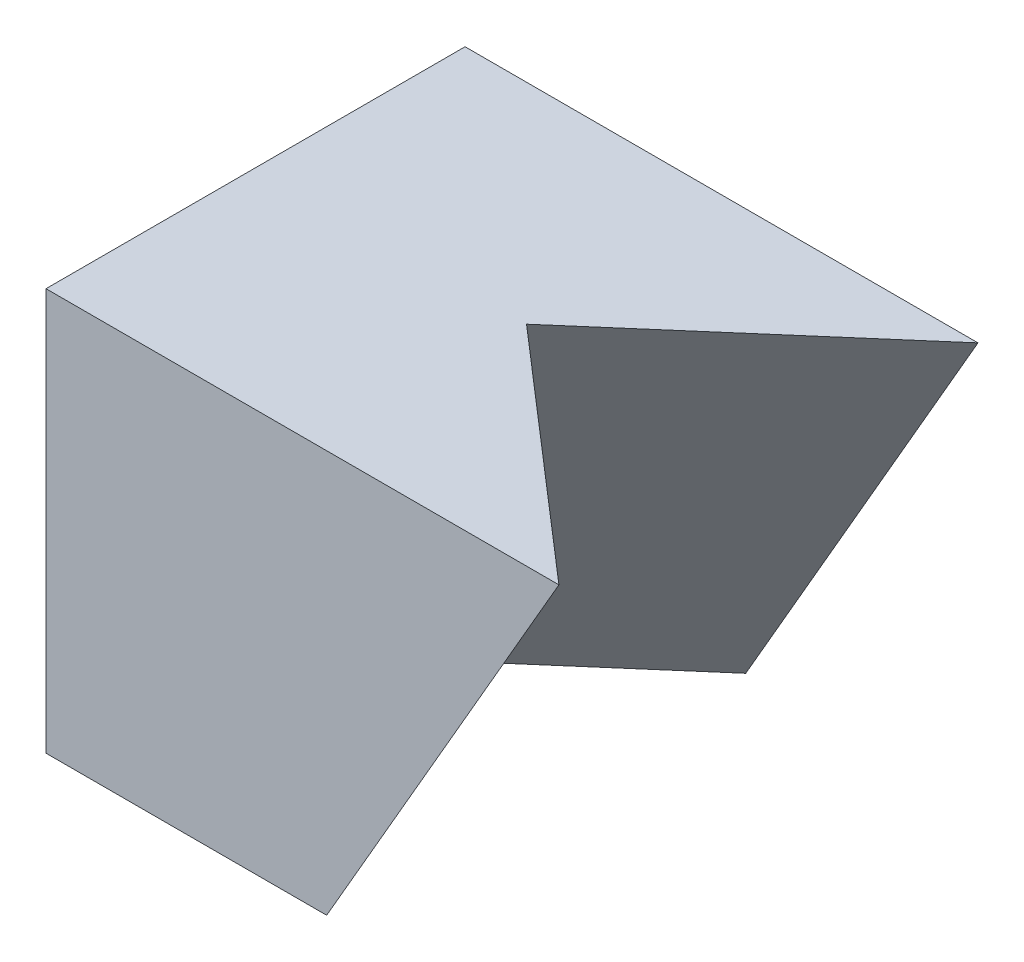
ISO-10303-21;
HEADER;
FILE_DESCRIPTION(('STEP AP214'),'2;1');
FILE_NAME('part.step','',(''),(''),'','','');
FILE_SCHEMA(('AUTOMOTIVE_DESIGN { 1 0 10303 214 1 1 1 1 }'));
ENDSEC;
DATA;
#1=APPLICATION_CONTEXT('core data for automotive mechanical design processes');
#2=APPLICATION_PROTOCOL_DEFINITION('international standard','automotive_design',2000,#1);
#3=PRODUCT_CONTEXT('',#1,'mechanical');
#4=PRODUCT('Part','Part','',(#3));
#5=PRODUCT_RELATED_PRODUCT_CATEGORY('part','',(#4));
#6=PRODUCT_DEFINITION_FORMATION('','',#4);
#7=PRODUCT_DEFINITION_CONTEXT('part definition',#1,'design');
#8=PRODUCT_DEFINITION('design','',#6,#7);
#9=PRODUCT_DEFINITION_SHAPE('','',#8);
#10=(LENGTH_UNIT() NAMED_UNIT(*) SI_UNIT(.MILLI.,.METRE.));
#11=(NAMED_UNIT(*) PLANE_ANGLE_UNIT() SI_UNIT($,.RADIAN.));
#12=(NAMED_UNIT(*) SI_UNIT($,.STERADIAN.) SOLID_ANGLE_UNIT());
#13=UNCERTAINTY_MEASURE_WITH_UNIT(LENGTH_MEASURE(1.E-05),#10,'distance_accuracy_value','');
#14=(GEOMETRIC_REPRESENTATION_CONTEXT(3) GLOBAL_UNCERTAINTY_ASSIGNED_CONTEXT((#13)) GLOBAL_UNIT_ASSIGNED_CONTEXT((#10,
#11,#12)) REPRESENTATION_CONTEXT('',''));
#15=CARTESIAN_POINT('',(0.,0.,0.));
#16=DIRECTION('',(0.,0.,1.));
#17=DIRECTION('',(1.,0.,0.));
#18=AXIS2_PLACEMENT_3D('',#15,#16,#17);
#19=CARTESIAN_POINT('',(-17.5,24.,-12.5));
#20=DIRECTION('',(0.,0.,1.));
#21=DIRECTION('',(1.,0.,0.));
#22=AXIS2_PLACEMENT_3D('',#19,#20,#21);
#23=PLANE('',#22);
#24=DIRECTION('',(-1.,0.,0.));
#25=VECTOR('',#24,1.);
#26=CARTESIAN_POINT('',(-17.5,24.,-12.5));
#27=LINE('',#26,#25);
#28=CARTESIAN_POINT('',(13.0995642670499,24.,-12.5));
#29=VERTEX_POINT('',#28);
#30=CARTESIAN_POINT('',(-17.5,24.,-12.5));
#31=VERTEX_POINT('',#30);
#32=EDGE_CURVE('E89',#29,#31,#27,.T.);
#33=ORIENTED_EDGE('',*,*,#32,.F.);
#34=DIRECTION('',(-0.499999999999995,-0.866025403784442,0.));
#35=VECTOR('',#34,1.);
#36=CARTESIAN_POINT('',(5.44967320028759,10.7500000000002,-12.5));
#37=LINE('',#36,#35);
#38=CARTESIAN_POINT('',(-0.756842193500917,0.,-12.5));
#39=VERTEX_POINT('',#38);
#40=EDGE_CURVE('E115',#29,#39,#37,.T.);
#41=ORIENTED_EDGE('',*,*,#40,.T.);
#42=DIRECTION('',(-1.,0.,0.));
#43=VECTOR('',#42,1.);
#44=CARTESIAN_POINT('',(-17.5,0.,-12.5));
#45=LINE('',#44,#43);
#46=CARTESIAN_POINT('',(-17.5,0.,-12.5));
#47=VERTEX_POINT('',#46);
#48=EDGE_CURVE('E80',#39,#47,#45,.T.);
#49=ORIENTED_EDGE('',*,*,#48,.T.);
#50=DIRECTION('',(0.,-1.,0.));
#51=VECTOR('',#50,1.);
#52=CARTESIAN_POINT('',(-17.5,24.,-12.5));
#53=LINE('',#52,#51);
#54=EDGE_CURVE('E75',#31,#47,#53,.T.);
#55=ORIENTED_EDGE('',*,*,#54,.F.);
#56=EDGE_LOOP('',(#33,#41,#49,#55));
#57=FACE_BOUND('',#56,.T.);
#58=ADVANCED_FACE('F33',(#57),#23,.F.);
#59=CARTESIAN_POINT('',(-17.5,24.,12.5));
#60=DIRECTION('',(1.,0.,0.));
#61=DIRECTION('',(0.,0.,-1.));
#62=AXIS2_PLACEMENT_3D('',#59,#60,#61);
#63=PLANE('',#62);
#64=CARTESIAN_POINT('',(-17.5,9.5,-10.5));
#65=DIRECTION('',(-1.,0.,0.));
#66=DIRECTION('',(0.,0.,1.));
#67=AXIS2_PLACEMENT_3D('',#64,#65,#66);
#68=CIRCLE('',#67,0.949999999999999);
#69=CARTESIAN_POINT('',(-17.5,9.5,-9.55));
#70=VERTEX_POINT('',#69);
#71=EDGE_CURVE('E130',#70,#70,#68,.T.);
#72=ORIENTED_EDGE('',*,*,#71,.F.);
#73=EDGE_LOOP('',(#72));
#74=FACE_BOUND('',#73,.T.);
#75=CARTESIAN_POINT('',(-17.5,9.5,10.5));
#76=DIRECTION('',(-1.,0.,0.));
#77=DIRECTION('',(0.,0.,1.));
#78=AXIS2_PLACEMENT_3D('',#75,#76,#77);
#79=CIRCLE('',#78,0.949999999999999);
#80=CARTESIAN_POINT('',(-17.5,9.5,11.45));
#81=VERTEX_POINT('',#80);
#82=EDGE_CURVE('E136',#81,#81,#79,.T.);
#83=ORIENTED_EDGE('',*,*,#82,.F.);
#84=EDGE_LOOP('',(#83));
#85=FACE_BOUND('',#84,.T.);
#86=CARTESIAN_POINT('',(-17.5,22.,10.5));
#87=DIRECTION('',(-1.,0.,0.));
#88=DIRECTION('',(0.,0.,1.));
#89=AXIS2_PLACEMENT_3D('',#86,#87,#88);
#90=CIRCLE('',#89,0.949999999999999);
#91=CARTESIAN_POINT('',(-17.5,22.,11.45));
#92=VERTEX_POINT('',#91);
#93=EDGE_CURVE('E142',#92,#92,#90,.T.);
#94=ORIENTED_EDGE('',*,*,#93,.F.);
#95=EDGE_LOOP('',(#94));
#96=FACE_BOUND('',#95,.T.);
#97=CARTESIAN_POINT('',(-17.5,22.,-10.5));
#98=DIRECTION('',(-1.,0.,0.));
#99=DIRECTION('',(0.,0.,1.));
#100=AXIS2_PLACEMENT_3D('',#97,#98,#99);
#101=CIRCLE('',#100,0.949999999999999);
#102=CARTESIAN_POINT('',(-17.5,22.,-9.55));
#103=VERTEX_POINT('',#102);
#104=EDGE_CURVE('E124',#103,#103,#101,.T.);
#105=ORIENTED_EDGE('',*,*,#104,.F.);
#106=EDGE_LOOP('',(#105));
#107=FACE_BOUND('',#106,.T.);
#108=DIRECTION('',(0.,0.,1.));
#109=VECTOR('',#108,1.);
#110=CARTESIAN_POINT('',(-17.5,0.,12.5));
#111=LINE('',#110,#109);
#112=CARTESIAN_POINT('',(-17.5,0.,12.5));
#113=VERTEX_POINT('',#112);
#114=EDGE_CURVE('E69',#47,#113,#111,.T.);
#115=ORIENTED_EDGE('',*,*,#114,.T.);
#116=DIRECTION('',(0.,-1.,0.));
#117=VECTOR('',#116,1.);
#118=CARTESIAN_POINT('',(-17.5,24.,12.5));
#119=LINE('',#118,#117);
#120=CARTESIAN_POINT('',(-17.5,24.,12.5));
#121=VERTEX_POINT('',#120);
#122=EDGE_CURVE('E72',#121,#113,#119,.T.);
#123=ORIENTED_EDGE('',*,*,#122,.F.);
#124=DIRECTION('',(0.,0.,1.));
#125=VECTOR('',#124,1.);
#126=CARTESIAN_POINT('',(-17.5,24.,12.5));
#127=LINE('',#126,#125);
#128=EDGE_CURVE('E56',#31,#121,#127,.T.);
#129=ORIENTED_EDGE('',*,*,#128,.F.);
#130=ORIENTED_EDGE('',*,*,#54,.T.);
#131=EDGE_LOOP('',(#115,#123,#129,#130));
#132=FACE_BOUND('',#131,.T.);
#133=ADVANCED_FACE('F71',(#74,#85,#96,#107,#132),#63,.F.);
#134=CARTESIAN_POINT('',(-17.5,24.,12.5));
#135=DIRECTION('',(0.,0.,-1.));
#136=DIRECTION('',(-1.,0.,0.));
#137=AXIS2_PLACEMENT_3D('',#134,#135,#136);
#138=PLANE('',#137);
#139=DIRECTION('',(1.,0.,0.));
#140=VECTOR('',#139,1.);
#141=CARTESIAN_POINT('',(-17.5,0.,12.5));
#142=LINE('',#141,#140);
#143=CARTESIAN_POINT('',(-0.756842193500918,0.,12.5));
#144=VERTEX_POINT('',#143);
#145=EDGE_CURVE('E79',#113,#144,#142,.T.);
#146=ORIENTED_EDGE('',*,*,#145,.T.);
#147=DIRECTION('',(0.499999999999995,0.866025403784442,0.));
#148=VECTOR('',#147,1.);
#149=CARTESIAN_POINT('',(5.44967320028759,10.7500000000002,12.5));
#150=LINE('',#149,#148);
#151=CARTESIAN_POINT('',(13.0995642670499,24.,12.5));
#152=VERTEX_POINT('',#151);
#153=EDGE_CURVE('E47',#144,#152,#150,.T.);
#154=ORIENTED_EDGE('',*,*,#153,.T.);
#155=DIRECTION('',(1.,0.,0.));
#156=VECTOR('',#155,1.);
#157=CARTESIAN_POINT('',(-17.5,24.,12.5));
#158=LINE('',#157,#156);
#159=EDGE_CURVE('E85',#121,#152,#158,.T.);
#160=ORIENTED_EDGE('',*,*,#159,.F.);
#161=ORIENTED_EDGE('',*,*,#122,.T.);
#162=EDGE_LOOP('',(#146,#154,#160,#161));
#163=FACE_BOUND('',#162,.T.);
#164=ADVANCED_FACE('F84',(#163),#138,.F.);
#165=CARTESIAN_POINT('',(0.,24.,0.));
#166=DIRECTION('',(0.,-1.,0.));
#167=DIRECTION('',(0.,0.,-1.));
#168=AXIS2_PLACEMENT_3D('',#165,#166,#167);
#169=PLANE('',#168);
#170=DIRECTION('',(-0.755928946018453,0.,-0.654653670707978));
#171=VECTOR('',#170,1.);
#172=CARTESIAN_POINT('',(-0.57179676972458,24.,0.660254037844487));
#173=LINE('',#172,#171);
#174=CARTESIAN_POINT('',(-1.33419246269068,24.,0.));
#175=VERTEX_POINT('',#174);
#176=EDGE_CURVE('E121',#152,#175,#173,.T.);
#177=ORIENTED_EDGE('',*,*,#176,.T.);
#178=DIRECTION('',(0.755928946018453,0.,-0.654653670707978));
#179=VECTOR('',#178,1.);
#180=CARTESIAN_POINT('',(-0.57179676972458,24.,-0.660254037844487));
#181=LINE('',#180,#179);
#182=EDGE_CURVE('E110',#175,#29,#181,.T.);
#183=ORIENTED_EDGE('',*,*,#182,.T.);
#184=ORIENTED_EDGE('',*,*,#32,.T.);
#185=ORIENTED_EDGE('',*,*,#128,.T.);
#186=ORIENTED_EDGE('',*,*,#159,.T.);
#187=EDGE_LOOP('',(#177,#183,#184,#185,#186));
#188=FACE_BOUND('',#187,.T.);
#189=ADVANCED_FACE('F179',(#188),#169,.F.);
#190=CARTESIAN_POINT('',(0.,0.,0.));
#191=DIRECTION('',(0.,-1.,0.));
#192=DIRECTION('',(0.,0.,-1.));
#193=AXIS2_PLACEMENT_3D('',#190,#191,#192);
#194=PLANE('',#193);
#195=DIRECTION('',(0.755928946018453,0.,-0.654653670707978));
#196=VECTOR('',#195,1.);
#197=CARTESIAN_POINT('',(-6.51025668138925,0.,-7.51739689498725));
#198=LINE('',#197,#196);
#199=CARTESIAN_POINT('',(-15.1905989232415,0.,0.));
#200=VERTEX_POINT('',#199);
#201=EDGE_CURVE('E11',#200,#39,#198,.T.);
#202=ORIENTED_EDGE('',*,*,#201,.F.);
#203=DIRECTION('',(-0.755928946018453,0.,-0.654653670707978));
#204=VECTOR('',#203,1.);
#205=CARTESIAN_POINT('',(-6.51025668138925,0.,7.51739689498725));
#206=LINE('',#205,#204);
#207=EDGE_CURVE('E40',#144,#200,#206,.T.);
#208=ORIENTED_EDGE('',*,*,#207,.F.);
#209=ORIENTED_EDGE('',*,*,#145,.F.);
#210=ORIENTED_EDGE('',*,*,#114,.F.);
#211=ORIENTED_EDGE('',*,*,#48,.F.);
#212=EDGE_LOOP('',(#202,#208,#209,#210,#211));
#213=FACE_BOUND('',#212,.T.);
#214=ADVANCED_FACE('F88',(#213),#194,.T.);
#215=CARTESIAN_POINT('',(21.0459890228503,21.952722283114,-20.4054445662277));
#216=DIRECTION('',(-0.612372435695797,0.35355339059327,-0.707106781186548));
#217=DIRECTION('',(-0.755928946018453,0.,0.654653670707978));
#218=AXIS2_PLACEMENT_3D('',#215,#216,#217);
#219=PLANE('',#218);
#220=DIRECTION('',(-0.499999999999995,-0.866025403784442,0.));
#221=VECTOR('',#220,1.);
#222=CARTESIAN_POINT('',(3.3743556529819,32.1554445662277,0.));
#223=LINE('',#222,#221);
#224=EDGE_CURVE('E99',#175,#200,#223,.T.);
#225=ORIENTED_EDGE('',*,*,#224,.T.);
#226=ORIENTED_EDGE('',*,*,#201,.T.);
#227=ORIENTED_EDGE('',*,*,#40,.F.);
#228=ORIENTED_EDGE('',*,*,#182,.F.);
#229=EDGE_LOOP('',(#225,#226,#227,#228));
#230=FACE_BOUND('',#229,.T.);
#231=ADVANCED_FACE('F105',(#230),#219,.F.);
#232=CARTESIAN_POINT('',(3.3743556529819,32.1554445662277,0.));
#233=DIRECTION('',(-0.612372435695797,0.35355339059327,0.707106781186548));
#234=DIRECTION('',(0.755928946018453,0.,0.654653670707978));
#235=AXIS2_PLACEMENT_3D('',#232,#233,#234);
#236=PLANE('',#235);
#237=ORIENTED_EDGE('',*,*,#153,.F.);
#238=ORIENTED_EDGE('',*,*,#207,.T.);
#239=ORIENTED_EDGE('',*,*,#224,.F.);
#240=ORIENTED_EDGE('',*,*,#176,.F.);
#241=EDGE_LOOP('',(#237,#238,#239,#240));
#242=FACE_BOUND('',#241,.T.);
#243=ADVANCED_FACE('F97',(#242),#236,.F.);
#244=CARTESIAN_POINT('',(-10.5,22.,-10.5));
#245=DIRECTION('',(-1.,0.,0.));
#246=DIRECTION('',(0.,0.,1.));
#247=AXIS2_PLACEMENT_3D('',#244,#245,#246);
#248=CYLINDRICAL_SURFACE('',#247,0.949999999999999);
#249=CARTESIAN_POINT('',(-10.5,22.,-10.5));
#250=DIRECTION('',(-1.,0.,0.));
#251=DIRECTION('',(0.,0.,1.));
#252=AXIS2_PLACEMENT_3D('',#249,#250,#251);
#253=CIRCLE('',#252,0.949999999999999);
#254=CARTESIAN_POINT('',(-10.5,22.,-9.55));
#255=VERTEX_POINT('',#254);
#256=EDGE_CURVE('E111',#255,#255,#253,.T.);
#257=ORIENTED_EDGE('',*,*,#256,.F.);
#258=EDGE_LOOP('',(#257));
#259=FACE_BOUND('',#258,.T.);
#260=ORIENTED_EDGE('',*,*,#104,.T.);
#261=EDGE_LOOP('',(#260));
#262=FACE_BOUND('',#261,.T.);
#263=ADVANCED_FACE('F162',(#259,#262),#248,.F.);
#264=CARTESIAN_POINT('',(-10.5,22.,-10.5));
#265=DIRECTION('',(-1.,0.,0.));
#266=DIRECTION('',(0.,0.,1.));
#267=AXIS2_PLACEMENT_3D('',#264,#265,#266);
#268=PLANE('',#267);
#269=ORIENTED_EDGE('',*,*,#256,.T.);
#270=EDGE_LOOP('',(#269));
#271=FACE_BOUND('',#270,.T.);
#272=ADVANCED_FACE('F153',(#271),#268,.T.);
#273=CARTESIAN_POINT('',(-10.5,22.,10.5));
#274=DIRECTION('',(-1.,0.,0.));
#275=DIRECTION('',(0.,0.,1.));
#276=AXIS2_PLACEMENT_3D('',#273,#274,#275);
#277=CYLINDRICAL_SURFACE('',#276,0.949999999999999);
#278=CARTESIAN_POINT('',(-10.5,22.,10.5));
#279=DIRECTION('',(-1.,0.,0.));
#280=DIRECTION('',(0.,0.,1.));
#281=AXIS2_PLACEMENT_3D('',#278,#279,#280);
#282=CIRCLE('',#281,0.949999999999999);
#283=CARTESIAN_POINT('',(-10.5,22.,11.45));
#284=VERTEX_POINT('',#283);
#285=EDGE_CURVE('E127',#284,#284,#282,.T.);
#286=ORIENTED_EDGE('',*,*,#285,.F.);
#287=EDGE_LOOP('',(#286));
#288=FACE_BOUND('',#287,.T.);
#289=ORIENTED_EDGE('',*,*,#93,.T.);
#290=EDGE_LOOP('',(#289));
#291=FACE_BOUND('',#290,.T.);
#292=ADVANCED_FACE('F150',(#288,#291),#277,.F.);
#293=CARTESIAN_POINT('',(-10.5,22.,10.5));
#294=DIRECTION('',(-1.,0.,0.));
#295=DIRECTION('',(0.,0.,1.));
#296=AXIS2_PLACEMENT_3D('',#293,#294,#295);
#297=PLANE('',#296);
#298=ORIENTED_EDGE('',*,*,#285,.T.);
#299=EDGE_LOOP('',(#298));
#300=FACE_BOUND('',#299,.T.);
#301=ADVANCED_FACE('F148',(#300),#297,.T.);
#302=CARTESIAN_POINT('',(-10.5,9.5,10.5));
#303=DIRECTION('',(-1.,0.,0.));
#304=DIRECTION('',(0.,0.,1.));
#305=AXIS2_PLACEMENT_3D('',#302,#303,#304);
#306=CYLINDRICAL_SURFACE('',#305,0.949999999999999);
#307=CARTESIAN_POINT('',(-10.5,9.5,10.5));
#308=DIRECTION('',(-1.,0.,0.));
#309=DIRECTION('',(0.,0.,1.));
#310=AXIS2_PLACEMENT_3D('',#307,#308,#309);
#311=CIRCLE('',#310,0.949999999999999);
#312=CARTESIAN_POINT('',(-10.5,9.5,11.45));
#313=VERTEX_POINT('',#312);
#314=EDGE_CURVE('E139',#313,#313,#311,.T.);
#315=ORIENTED_EDGE('',*,*,#314,.F.);
#316=EDGE_LOOP('',(#315));
#317=FACE_BOUND('',#316,.T.);
#318=ORIENTED_EDGE('',*,*,#82,.T.);
#319=EDGE_LOOP('',(#318));
#320=FACE_BOUND('',#319,.T.);
#321=ADVANCED_FACE('F232',(#317,#320),#306,.F.);
#322=CARTESIAN_POINT('',(-10.5,9.5,10.5));
#323=DIRECTION('',(-1.,0.,0.));
#324=DIRECTION('',(0.,0.,1.));
#325=AXIS2_PLACEMENT_3D('',#322,#323,#324);
#326=PLANE('',#325);
#327=ORIENTED_EDGE('',*,*,#314,.T.);
#328=EDGE_LOOP('',(#327));
#329=FACE_BOUND('',#328,.T.);
#330=ADVANCED_FACE('F241',(#329),#326,.T.);
#331=CARTESIAN_POINT('',(-10.5,9.5,-10.5));
#332=DIRECTION('',(-1.,0.,0.));
#333=DIRECTION('',(0.,0.,1.));
#334=AXIS2_PLACEMENT_3D('',#331,#332,#333);
#335=CYLINDRICAL_SURFACE('',#334,0.949999999999999);
#336=CARTESIAN_POINT('',(-10.5,9.5,-10.5));
#337=DIRECTION('',(-1.,0.,0.));
#338=DIRECTION('',(0.,0.,1.));
#339=AXIS2_PLACEMENT_3D('',#336,#337,#338);
#340=CIRCLE('',#339,0.949999999999999);
#341=CARTESIAN_POINT('',(-10.5,9.5,-9.55));
#342=VERTEX_POINT('',#341);
#343=EDGE_CURVE('E133',#342,#342,#340,.T.);
#344=ORIENTED_EDGE('',*,*,#343,.F.);
#345=EDGE_LOOP('',(#344));
#346=FACE_BOUND('',#345,.T.);
#347=ORIENTED_EDGE('',*,*,#71,.T.);
#348=EDGE_LOOP('',(#347));
#349=FACE_BOUND('',#348,.T.);
#350=ADVANCED_FACE('F251',(#346,#349),#335,.F.);
#351=CARTESIAN_POINT('',(-10.5,9.5,-10.5));
#352=DIRECTION('',(-1.,0.,0.));
#353=DIRECTION('',(0.,0.,1.));
#354=AXIS2_PLACEMENT_3D('',#351,#352,#353);
#355=PLANE('',#354);
#356=ORIENTED_EDGE('',*,*,#343,.T.);
#357=EDGE_LOOP('',(#356));
#358=FACE_BOUND('',#357,.T.);
#359=ADVANCED_FACE('F261',(#358),#355,.T.);
#360=CLOSED_SHELL('',(#58,#133,#164,#189,#214,#231,#243,#263,#272,#292,#301,#321,#330,#350,#359));
#361=MANIFOLD_SOLID_BREP('B2',#360);
#362=ADVANCED_BREP_SHAPE_REPRESENTATION('',(#18,#361),#14);
#363=SHAPE_DEFINITION_REPRESENTATION(#9,#362);
ENDSEC;
END-ISO-10303-21;
